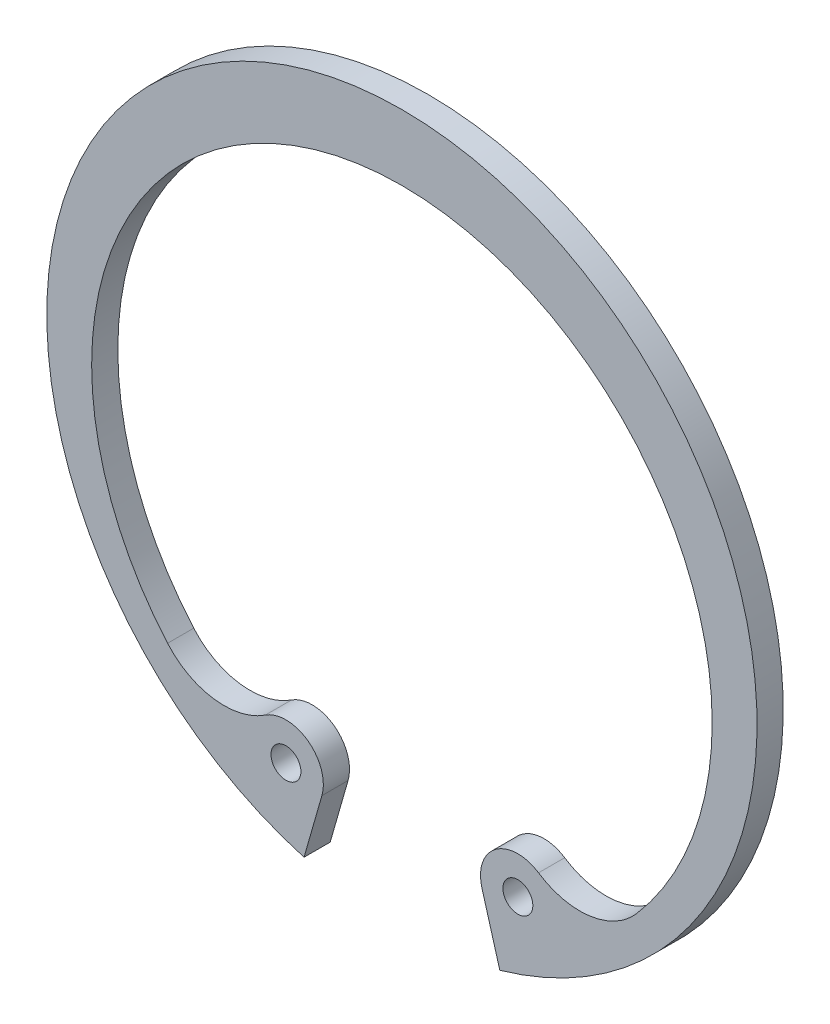
ISO-10303-21;
HEADER;
FILE_DESCRIPTION(('STEP AP214'),'2;1');
FILE_NAME('part.step','',(''),(''),'','','');
FILE_SCHEMA(('AUTOMOTIVE_DESIGN { 1 0 10303 214 1 1 1 1 }'));
ENDSEC;
DATA;
#1=APPLICATION_CONTEXT('core data for automotive mechanical design processes');
#2=APPLICATION_PROTOCOL_DEFINITION('international standard','automotive_design',2000,#1);
#3=PRODUCT_CONTEXT('',#1,'mechanical');
#4=PRODUCT('Part','Part','',(#3));
#5=PRODUCT_RELATED_PRODUCT_CATEGORY('part','',(#4));
#6=PRODUCT_DEFINITION_FORMATION('','',#4);
#7=PRODUCT_DEFINITION_CONTEXT('part definition',#1,'design');
#8=PRODUCT_DEFINITION('design','',#6,#7);
#9=PRODUCT_DEFINITION_SHAPE('','',#8);
#10=(LENGTH_UNIT() NAMED_UNIT(*) SI_UNIT(.MILLI.,.METRE.));
#11=(NAMED_UNIT(*) PLANE_ANGLE_UNIT() SI_UNIT($,.RADIAN.));
#12=(NAMED_UNIT(*) SI_UNIT($,.STERADIAN.) SOLID_ANGLE_UNIT());
#13=UNCERTAINTY_MEASURE_WITH_UNIT(LENGTH_MEASURE(1.E-05),#10,'distance_accuracy_value','');
#14=(GEOMETRIC_REPRESENTATION_CONTEXT(3) GLOBAL_UNCERTAINTY_ASSIGNED_CONTEXT((#13)) GLOBAL_UNIT_ASSIGNED_CONTEXT((#10,
#11,#12)) REPRESENTATION_CONTEXT('',''));
#15=CARTESIAN_POINT('',(0.,0.,0.));
#16=DIRECTION('',(0.,0.,1.));
#17=DIRECTION('',(1.,0.,0.));
#18=AXIS2_PLACEMENT_3D('',#15,#16,#17);
#19=CARTESIAN_POINT('',(-7.75514484056616,-17.9755159347105,1.75));
#20=DIRECTION('',(0.,0.,-1.));
#21=DIRECTION('',(-1.,0.,0.));
#22=AXIS2_PLACEMENT_3D('',#19,#20,#21);
#23=CYLINDRICAL_SURFACE('',#22,1.);
#24=CARTESIAN_POINT('',(-7.75514484056616,-17.9755159347105,1.75));
#25=DIRECTION('',(0.,0.,1.));
#26=DIRECTION('',(1.,0.,0.));
#27=AXIS2_PLACEMENT_3D('',#24,#25,#26);
#28=CIRCLE('',#27,1.);
#29=CARTESIAN_POINT('',(-6.75514484056616,-17.9755159347105,1.75));
#30=VERTEX_POINT('',#29);
#31=EDGE_CURVE('E189',#30,#30,#28,.T.);
#32=ORIENTED_EDGE('',*,*,#31,.T.);
#33=EDGE_LOOP('',(#32));
#34=FACE_BOUND('',#33,.T.);
#35=CARTESIAN_POINT('',(-7.75514484056616,-17.9755159347105,0.));
#36=DIRECTION('',(0.,0.,1.));
#37=DIRECTION('',(1.,0.,0.));
#38=AXIS2_PLACEMENT_3D('',#35,#36,#37);
#39=CIRCLE('',#38,1.);
#40=CARTESIAN_POINT('',(-6.75514484056616,-17.9755159347105,0.));
#41=VERTEX_POINT('',#40);
#42=EDGE_CURVE('E217',#41,#41,#39,.T.);
#43=ORIENTED_EDGE('',*,*,#42,.F.);
#44=EDGE_LOOP('',(#43));
#45=FACE_BOUND('',#44,.T.);
#46=ADVANCED_FACE('F96',(#34,#45),#23,.F.);
#47=CARTESIAN_POINT('',(0.,0.,0.));
#48=DIRECTION('',(0.,0.,1.));
#49=DIRECTION('',(1.,0.,0.));
#50=AXIS2_PLACEMENT_3D('',#47,#48,#49);
#51=PLANE('',#50);
#52=CARTESIAN_POINT('',(-7.75514484056616,-17.9755159347105,0.));
#53=DIRECTION('',(0.,0.,1.));
#54=DIRECTION('',(1.,0.,0.));
#55=AXIS2_PLACEMENT_3D('',#52,#53,#54);
#56=CIRCLE('',#55,2.5);
#57=CARTESIAN_POINT('',(-5.35199060072036,-18.664609324253,0.));
#58=VERTEX_POINT('',#57);
#59=CARTESIAN_POINT('',(-9.13541932338818,-15.8910873914232,0.));
#60=VERTEX_POINT('',#59);
#61=EDGE_CURVE('E173',#58,#60,#56,.T.);
#62=ORIENTED_EDGE('',*,*,#61,.F.);
#63=DIRECTION('',(-0.275637355817,-0.961261695938319,0.));
#64=VECTOR('',#63,1.);
#65=CARTESIAN_POINT('',(0.,0.,0.));
#66=LINE('',#65,#64);
#67=CARTESIAN_POINT('',(-6.54638720065374,-22.8299652785351,0.));
#68=VERTEX_POINT('',#67);
#69=EDGE_CURVE('E208',#58,#68,#66,.T.);
#70=ORIENTED_EDGE('',*,*,#69,.T.);
#71=CARTESIAN_POINT('',(0.,0.,0.));
#72=DIRECTION('',(0.,0.,1.));
#73=DIRECTION('',(1.,0.,0.));
#74=AXIS2_PLACEMENT_3D('',#71,#72,#73);
#75=CIRCLE('',#74,23.75);
#76=CARTESIAN_POINT('',(6.54638720065375,-22.8299652785351,0.));
#77=VERTEX_POINT('',#76);
#78=EDGE_CURVE('E205',#77,#68,#75,.T.);
#79=ORIENTED_EDGE('',*,*,#78,.F.);
#80=DIRECTION('',(0.275637355817,-0.961261695938319,0.));
#81=VECTOR('',#80,1.);
#82=CARTESIAN_POINT('',(0.,0.,0.));
#83=LINE('',#82,#81);
#84=CARTESIAN_POINT('',(5.35199060072037,-18.664609324253,0.));
#85=VERTEX_POINT('',#84);
#86=EDGE_CURVE('E203',#85,#77,#83,.T.);
#87=ORIENTED_EDGE('',*,*,#86,.F.);
#88=CARTESIAN_POINT('',(7.75514484056616,-17.9755159347105,0.));
#89=DIRECTION('',(0.,0.,1.));
#90=DIRECTION('',(1.,0.,0.));
#91=AXIS2_PLACEMENT_3D('',#88,#89,#90);
#92=CIRCLE('',#91,2.5);
#93=CARTESIAN_POINT('',(9.13541932338818,-15.8910873914232,0.));
#94=VERTEX_POINT('',#93);
#95=EDGE_CURVE('E200',#85,#94,#92,.F.);
#96=ORIENTED_EDGE('',*,*,#95,.T.);
#97=CARTESIAN_POINT('',(11.8959682890322,-11.7222303048488,0.));
#98=DIRECTION('',(0.,0.,1.));
#99=DIRECTION('',(1.,0.,0.));
#100=AXIS2_PLACEMENT_3D('',#97,#98,#99);
#101=CIRCLE('',#100,5.);
#102=CARTESIAN_POINT('',(15.6724661585663,-14.9991288143247,0.));
#103=VERTEX_POINT('',#102);
#104=EDGE_CURVE('E198',#103,#94,#101,.F.);
#105=ORIENTED_EDGE('',*,*,#104,.F.);
#106=CARTESIAN_POINT('',(0.,-1.4,0.));
#107=DIRECTION('',(0.,0.,1.));
#108=DIRECTION('',(1.,0.,0.));
#109=AXIS2_PLACEMENT_3D('',#106,#107,#108);
#110=CIRCLE('',#109,20.75);
#111=CARTESIAN_POINT('',(-15.6724661585663,-14.9991288143247,0.));
#112=VERTEX_POINT('',#111);
#113=EDGE_CURVE('E214',#103,#112,#110,.T.);
#114=ORIENTED_EDGE('',*,*,#113,.T.);
#115=CARTESIAN_POINT('',(-11.8959682890322,-11.7222303048488,0.));
#116=DIRECTION('',(0.,0.,1.));
#117=DIRECTION('',(1.,0.,0.));
#118=AXIS2_PLACEMENT_3D('',#115,#116,#117);
#119=CIRCLE('',#118,5.);
#120=EDGE_CURVE('E212',#112,#60,#119,.T.);
#121=ORIENTED_EDGE('',*,*,#120,.T.);
#122=EDGE_LOOP('',(#62,#70,#79,#87,#96,#105,#114,#121));
#123=FACE_BOUND('',#122,.T.);
#124=ORIENTED_EDGE('',*,*,#42,.T.);
#125=EDGE_LOOP('',(#124));
#126=FACE_BOUND('',#125,.T.);
#127=CARTESIAN_POINT('',(7.75514484056616,-17.9755159347105,0.));
#128=DIRECTION('',(0.,0.,1.));
#129=DIRECTION('',(1.,0.,0.));
#130=AXIS2_PLACEMENT_3D('',#127,#128,#129);
#131=CIRCLE('',#130,1.);
#132=CARTESIAN_POINT('',(8.75514484056616,-17.9755159347105,0.));
#133=VERTEX_POINT('',#132);
#134=EDGE_CURVE('E220',#133,#133,#131,.F.);
#135=ORIENTED_EDGE('',*,*,#134,.F.);
#136=EDGE_LOOP('',(#135));
#137=FACE_BOUND('',#136,.T.);
#138=ADVANCED_FACE('F241',(#123,#126,#137),#51,.F.);
#139=CARTESIAN_POINT('',(-7.75514484056616,-17.9755159347105,1.75));
#140=DIRECTION('',(0.,0.,-1.));
#141=DIRECTION('',(-1.,0.,0.));
#142=AXIS2_PLACEMENT_3D('',#139,#140,#141);
#143=CYLINDRICAL_SURFACE('',#142,2.5);
#144=ORIENTED_EDGE('',*,*,#61,.T.);
#145=DIRECTION('',(0.,0.,-1.));
#146=VECTOR('',#145,1.);
#147=CARTESIAN_POINT('',(-9.13541932338818,-15.8910873914232,1.75));
#148=LINE('',#147,#146);
#149=CARTESIAN_POINT('',(-9.13541932338818,-15.8910873914232,1.75));
#150=VERTEX_POINT('',#149);
#151=EDGE_CURVE('E167',#150,#60,#148,.T.);
#152=ORIENTED_EDGE('',*,*,#151,.F.);
#153=CARTESIAN_POINT('',(-7.75514484056616,-17.9755159347105,1.75));
#154=DIRECTION('',(0.,0.,1.));
#155=DIRECTION('',(1.,0.,0.));
#156=AXIS2_PLACEMENT_3D('',#153,#154,#155);
#157=CIRCLE('',#156,2.5);
#158=CARTESIAN_POINT('',(-5.35199060072036,-18.664609324253,1.75));
#159=VERTEX_POINT('',#158);
#160=EDGE_CURVE('E170',#159,#150,#157,.T.);
#161=ORIENTED_EDGE('',*,*,#160,.F.);
#162=DIRECTION('',(0.,0.,-1.));
#163=VECTOR('',#162,1.);
#164=CARTESIAN_POINT('',(-5.35199060072036,-18.664609324253,1.75));
#165=LINE('',#164,#163);
#166=EDGE_CURVE('E177',#159,#58,#165,.T.);
#167=ORIENTED_EDGE('',*,*,#166,.T.);
#168=EDGE_LOOP('',(#144,#152,#161,#167));
#169=FACE_BOUND('',#168,.T.);
#170=ADVANCED_FACE('F169',(#169),#143,.T.);
#171=CARTESIAN_POINT('',(0.,0.,1.75));
#172=DIRECTION('',(0.,0.,1.));
#173=DIRECTION('',(1.,0.,0.));
#174=AXIS2_PLACEMENT_3D('',#171,#172,#173);
#175=PLANE('',#174);
#176=ORIENTED_EDGE('',*,*,#160,.T.);
#177=CARTESIAN_POINT('',(-11.8959682890322,-11.7222303048488,1.75));
#178=DIRECTION('',(0.,0.,1.));
#179=DIRECTION('',(1.,0.,0.));
#180=AXIS2_PLACEMENT_3D('',#177,#178,#179);
#181=CIRCLE('',#180,5.);
#182=CARTESIAN_POINT('',(-15.6724661585663,-14.9991288143247,1.75));
#183=VERTEX_POINT('',#182);
#184=EDGE_CURVE('E182',#183,#150,#181,.T.);
#185=ORIENTED_EDGE('',*,*,#184,.F.);
#186=CARTESIAN_POINT('',(0.,-1.4,1.75));
#187=DIRECTION('',(0.,0.,1.));
#188=DIRECTION('',(1.,0.,0.));
#189=AXIS2_PLACEMENT_3D('',#186,#187,#188);
#190=CIRCLE('',#189,20.75);
#191=CARTESIAN_POINT('',(15.6724661585663,-14.9991288143247,1.75));
#192=VERTEX_POINT('',#191);
#193=EDGE_CURVE('E187',#192,#183,#190,.T.);
#194=ORIENTED_EDGE('',*,*,#193,.F.);
#195=CARTESIAN_POINT('',(11.8959682890322,-11.7222303048488,1.75));
#196=DIRECTION('',(0.,0.,1.));
#197=DIRECTION('',(1.,0.,0.));
#198=AXIS2_PLACEMENT_3D('',#195,#196,#197);
#199=CIRCLE('',#198,5.);
#200=CARTESIAN_POINT('',(9.13541932338818,-15.8910873914232,1.75));
#201=VERTEX_POINT('',#200);
#202=EDGE_CURVE('E150',#192,#201,#199,.F.);
#203=ORIENTED_EDGE('',*,*,#202,.T.);
#204=CARTESIAN_POINT('',(7.75514484056616,-17.9755159347105,1.75));
#205=DIRECTION('',(0.,0.,1.));
#206=DIRECTION('',(1.,0.,0.));
#207=AXIS2_PLACEMENT_3D('',#204,#205,#206);
#208=CIRCLE('',#207,2.5);
#209=CARTESIAN_POINT('',(5.35199060072037,-18.664609324253,1.75));
#210=VERTEX_POINT('',#209);
#211=EDGE_CURVE('E244',#210,#201,#208,.F.);
#212=ORIENTED_EDGE('',*,*,#211,.F.);
#213=DIRECTION('',(0.275637355817,-0.961261695938319,0.));
#214=VECTOR('',#213,1.);
#215=CARTESIAN_POINT('',(0.,0.,1.75));
#216=LINE('',#215,#214);
#217=CARTESIAN_POINT('',(6.54638720065375,-22.8299652785351,1.75));
#218=VERTEX_POINT('',#217);
#219=EDGE_CURVE('E235',#210,#218,#216,.T.);
#220=ORIENTED_EDGE('',*,*,#219,.T.);
#221=CARTESIAN_POINT('',(0.,0.,1.75));
#222=DIRECTION('',(0.,0.,1.));
#223=DIRECTION('',(1.,0.,0.));
#224=AXIS2_PLACEMENT_3D('',#221,#222,#223);
#225=CIRCLE('',#224,23.75);
#226=CARTESIAN_POINT('',(-6.54638720065374,-22.8299652785351,1.75));
#227=VERTEX_POINT('',#226);
#228=EDGE_CURVE('E336',#218,#227,#225,.T.);
#229=ORIENTED_EDGE('',*,*,#228,.T.);
#230=DIRECTION('',(-0.275637355817,-0.961261695938319,0.));
#231=VECTOR('',#230,1.);
#232=CARTESIAN_POINT('',(0.,0.,1.75));
#233=LINE('',#232,#231);
#234=EDGE_CURVE('E184',#159,#227,#233,.T.);
#235=ORIENTED_EDGE('',*,*,#234,.F.);
#236=EDGE_LOOP('',(#176,#185,#194,#203,#212,#220,#229,#235));
#237=FACE_BOUND('',#236,.T.);
#238=ORIENTED_EDGE('',*,*,#31,.F.);
#239=EDGE_LOOP('',(#238));
#240=FACE_BOUND('',#239,.T.);
#241=CARTESIAN_POINT('',(7.75514484056616,-17.9755159347105,1.75));
#242=DIRECTION('',(0.,0.,1.));
#243=DIRECTION('',(1.,0.,0.));
#244=AXIS2_PLACEMENT_3D('',#241,#242,#243);
#245=CIRCLE('',#244,1.);
#246=CARTESIAN_POINT('',(8.75514484056616,-17.9755159347105,1.75));
#247=VERTEX_POINT('',#246);
#248=EDGE_CURVE('E195',#247,#247,#245,.F.);
#249=ORIENTED_EDGE('',*,*,#248,.T.);
#250=EDGE_LOOP('',(#249));
#251=FACE_BOUND('',#250,.T.);
#252=ADVANCED_FACE('F180',(#237,#240,#251),#175,.T.);
#253=CARTESIAN_POINT('',(-11.8959682890322,-11.7222303048488,1.75));
#254=DIRECTION('',(0.,0.,-1.));
#255=DIRECTION('',(-1.,0.,0.));
#256=AXIS2_PLACEMENT_3D('',#253,#254,#255);
#257=CYLINDRICAL_SURFACE('',#256,5.);
#258=ORIENTED_EDGE('',*,*,#120,.F.);
#259=DIRECTION('',(0.,0.,-1.));
#260=VECTOR('',#259,1.);
#261=CARTESIAN_POINT('',(-15.6724661585663,-14.9991288143247,1.75));
#262=LINE('',#261,#260);
#263=EDGE_CURVE('E138',#183,#112,#262,.T.);
#264=ORIENTED_EDGE('',*,*,#263,.F.);
#265=ORIENTED_EDGE('',*,*,#184,.T.);
#266=ORIENTED_EDGE('',*,*,#151,.T.);
#267=EDGE_LOOP('',(#258,#264,#265,#266));
#268=FACE_BOUND('',#267,.T.);
#269=ADVANCED_FACE('F186',(#268),#257,.F.);
#270=CARTESIAN_POINT('',(0.,-1.4,1.75));
#271=DIRECTION('',(0.,0.,-1.));
#272=DIRECTION('',(-1.,0.,0.));
#273=AXIS2_PLACEMENT_3D('',#270,#271,#272);
#274=CYLINDRICAL_SURFACE('',#273,20.75);
#275=ORIENTED_EDGE('',*,*,#113,.F.);
#276=DIRECTION('',(0.,0.,-1.));
#277=VECTOR('',#276,1.);
#278=CARTESIAN_POINT('',(15.6724661585663,-14.9991288143247,1.75));
#279=LINE('',#278,#277);
#280=EDGE_CURVE('E113',#192,#103,#279,.T.);
#281=ORIENTED_EDGE('',*,*,#280,.F.);
#282=ORIENTED_EDGE('',*,*,#193,.T.);
#283=ORIENTED_EDGE('',*,*,#263,.T.);
#284=EDGE_LOOP('',(#275,#281,#282,#283));
#285=FACE_BOUND('',#284,.T.);
#286=ADVANCED_FACE('F245',(#285),#274,.F.);
#287=CARTESIAN_POINT('',(11.8959682890322,-11.7222303048488,1.75));
#288=DIRECTION('',(0.,0.,-1.));
#289=DIRECTION('',(-1.,0.,0.));
#290=AXIS2_PLACEMENT_3D('',#287,#288,#289);
#291=CYLINDRICAL_SURFACE('',#290,5.);
#292=ORIENTED_EDGE('',*,*,#104,.T.);
#293=DIRECTION('',(0.,0.,-1.));
#294=VECTOR('',#293,1.);
#295=CARTESIAN_POINT('',(9.13541932338818,-15.8910873914232,1.75));
#296=LINE('',#295,#294);
#297=EDGE_CURVE('E12',#201,#94,#296,.T.);
#298=ORIENTED_EDGE('',*,*,#297,.F.);
#299=ORIENTED_EDGE('',*,*,#202,.F.);
#300=ORIENTED_EDGE('',*,*,#280,.T.);
#301=EDGE_LOOP('',(#292,#298,#299,#300));
#302=FACE_BOUND('',#301,.T.);
#303=ADVANCED_FACE('F98',(#302),#291,.F.);
#304=CARTESIAN_POINT('',(7.75514484056616,-17.9755159347105,1.75));
#305=DIRECTION('',(0.,0.,-1.));
#306=DIRECTION('',(-1.,0.,0.));
#307=AXIS2_PLACEMENT_3D('',#304,#305,#306);
#308=CYLINDRICAL_SURFACE('',#307,2.5);
#309=ORIENTED_EDGE('',*,*,#95,.F.);
#310=DIRECTION('',(0.,0.,-1.));
#311=VECTOR('',#310,1.);
#312=CARTESIAN_POINT('',(5.35199060072037,-18.664609324253,1.75));
#313=LINE('',#312,#311);
#314=EDGE_CURVE('E105',#210,#85,#313,.T.);
#315=ORIENTED_EDGE('',*,*,#314,.F.);
#316=ORIENTED_EDGE('',*,*,#211,.T.);
#317=ORIENTED_EDGE('',*,*,#297,.T.);
#318=EDGE_LOOP('',(#309,#315,#316,#317));
#319=FACE_BOUND('',#318,.T.);
#320=ADVANCED_FACE('F243',(#319),#308,.T.);
#321=CARTESIAN_POINT('',(0.,0.,1.75));
#322=DIRECTION('',(0.961261695938319,0.275637355817,0.));
#323=DIRECTION('',(-0.275637355817,0.961261695938319,0.));
#324=AXIS2_PLACEMENT_3D('',#321,#322,#323);
#325=PLANE('',#324);
#326=ORIENTED_EDGE('',*,*,#86,.T.);
#327=DIRECTION('',(0.,0.,-1.));
#328=VECTOR('',#327,1.);
#329=CARTESIAN_POINT('',(6.54638720065375,-22.8299652785351,1.75));
#330=LINE('',#329,#328);
#331=EDGE_CURVE('E228',#218,#77,#330,.T.);
#332=ORIENTED_EDGE('',*,*,#331,.F.);
#333=ORIENTED_EDGE('',*,*,#219,.F.);
#334=ORIENTED_EDGE('',*,*,#314,.T.);
#335=EDGE_LOOP('',(#326,#332,#333,#334));
#336=FACE_BOUND('',#335,.T.);
#337=ADVANCED_FACE('F233',(#336),#325,.F.);
#338=CARTESIAN_POINT('',(0.,0.,1.75));
#339=DIRECTION('',(0.,0.,-1.));
#340=DIRECTION('',(-1.,0.,0.));
#341=AXIS2_PLACEMENT_3D('',#338,#339,#340);
#342=CYLINDRICAL_SURFACE('',#341,23.75);
#343=ORIENTED_EDGE('',*,*,#78,.T.);
#344=DIRECTION('',(0.,0.,-1.));
#345=VECTOR('',#344,1.);
#346=CARTESIAN_POINT('',(-6.54638720065374,-22.8299652785351,1.75));
#347=LINE('',#346,#345);
#348=EDGE_CURVE('E226',#227,#68,#347,.T.);
#349=ORIENTED_EDGE('',*,*,#348,.F.);
#350=ORIENTED_EDGE('',*,*,#228,.F.);
#351=ORIENTED_EDGE('',*,*,#331,.T.);
#352=EDGE_LOOP('',(#343,#349,#350,#351));
#353=FACE_BOUND('',#352,.T.);
#354=ADVANCED_FACE('F271',(#353),#342,.T.);
#355=CARTESIAN_POINT('',(0.,0.,1.75));
#356=DIRECTION('',(0.961261695938319,-0.275637355817,0.));
#357=DIRECTION('',(0.275637355817,0.961261695938319,0.));
#358=AXIS2_PLACEMENT_3D('',#355,#356,#357);
#359=PLANE('',#358);
#360=ORIENTED_EDGE('',*,*,#69,.F.);
#361=ORIENTED_EDGE('',*,*,#166,.F.);
#362=ORIENTED_EDGE('',*,*,#234,.T.);
#363=ORIENTED_EDGE('',*,*,#348,.T.);
#364=EDGE_LOOP('',(#360,#361,#362,#363));
#365=FACE_BOUND('',#364,.T.);
#366=ADVANCED_FACE('F266',(#365),#359,.T.);
#367=CARTESIAN_POINT('',(7.75514484056616,-17.9755159347105,1.75));
#368=DIRECTION('',(0.,0.,-1.));
#369=DIRECTION('',(-1.,0.,0.));
#370=AXIS2_PLACEMENT_3D('',#367,#368,#369);
#371=CYLINDRICAL_SURFACE('',#370,1.);
#372=ORIENTED_EDGE('',*,*,#248,.F.);
#373=EDGE_LOOP('',(#372));
#374=FACE_BOUND('',#373,.T.);
#375=ORIENTED_EDGE('',*,*,#134,.T.);
#376=EDGE_LOOP('',(#375));
#377=FACE_BOUND('',#376,.T.);
#378=ADVANCED_FACE('F264',(#374,#377),#371,.F.);
#379=CLOSED_SHELL('',(#46,#138,#170,#252,#269,#286,#303,#320,#337,#354,#366,#378));
#380=MANIFOLD_SOLID_BREP('B2',#379);
#381=ADVANCED_BREP_SHAPE_REPRESENTATION('',(#18,#380),#14);
#382=SHAPE_DEFINITION_REPRESENTATION(#9,#381);
ENDSEC;
END-ISO-10303-21;
